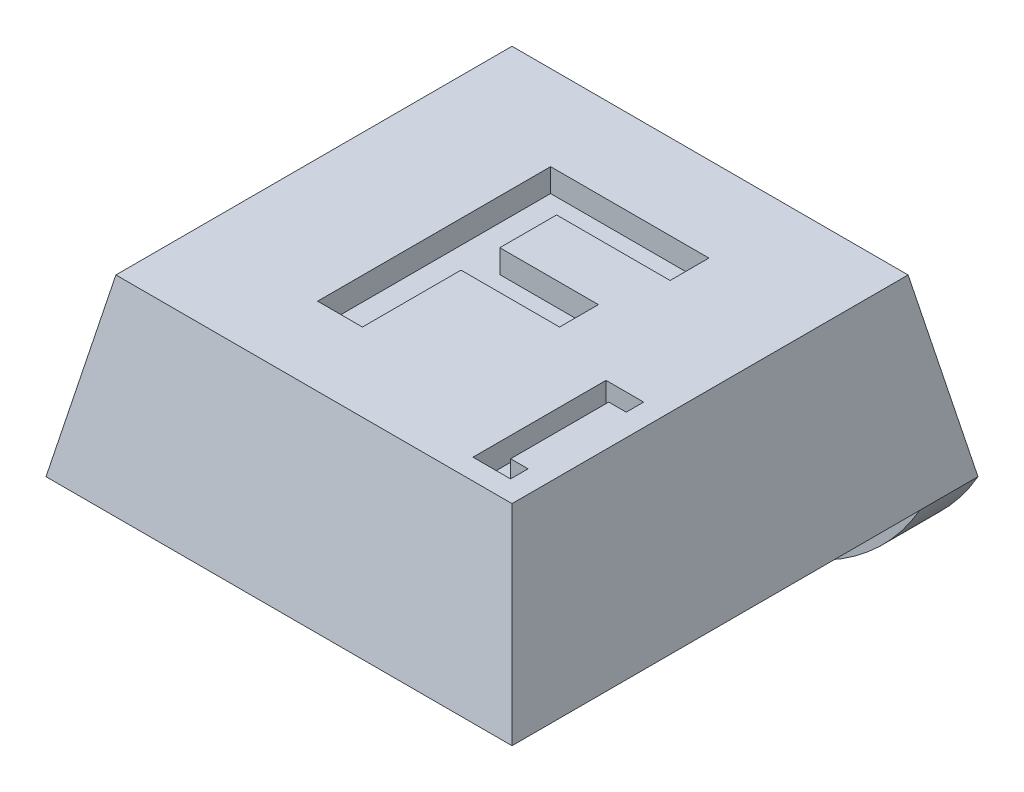
ISO-10303-21;
HEADER;
FILE_DESCRIPTION(('STEP AP214'),'2;1');
FILE_NAME('part.step','',(''),(''),'','','');
FILE_SCHEMA(('AUTOMOTIVE_DESIGN { 1 0 10303 214 1 1 1 1 }'));
ENDSEC;
DATA;
#1=APPLICATION_CONTEXT('core data for automotive mechanical design processes');
#2=APPLICATION_PROTOCOL_DEFINITION('international standard','automotive_design',2000,#1);
#3=PRODUCT_CONTEXT('',#1,'mechanical');
#4=PRODUCT('Part','Part','',(#3));
#5=PRODUCT_RELATED_PRODUCT_CATEGORY('part','',(#4));
#6=PRODUCT_DEFINITION_FORMATION('','',#4);
#7=PRODUCT_DEFINITION_CONTEXT('part definition',#1,'design');
#8=PRODUCT_DEFINITION('design','',#6,#7);
#9=PRODUCT_DEFINITION_SHAPE('','',#8);
#10=(LENGTH_UNIT() NAMED_UNIT(*) SI_UNIT(.MILLI.,.METRE.));
#11=(NAMED_UNIT(*) PLANE_ANGLE_UNIT() SI_UNIT($,.RADIAN.));
#12=(NAMED_UNIT(*) SI_UNIT($,.STERADIAN.) SOLID_ANGLE_UNIT());
#13=UNCERTAINTY_MEASURE_WITH_UNIT(LENGTH_MEASURE(1.E-05),#10,'distance_accuracy_value','');
#14=(GEOMETRIC_REPRESENTATION_CONTEXT(3) GLOBAL_UNCERTAINTY_ASSIGNED_CONTEXT((#13)) GLOBAL_UNIT_ASSIGNED_CONTEXT((#10,
#11,#12)) REPRESENTATION_CONTEXT('',''));
#15=CARTESIAN_POINT('',(0.,0.,0.));
#16=DIRECTION('',(0.,0.,1.));
#17=DIRECTION('',(1.,0.,0.));
#18=AXIS2_PLACEMENT_3D('',#15,#16,#17);
#19=CARTESIAN_POINT('',(0.,3.,0.));
#20=DIRECTION('',(0.,-1.,0.));
#21=DIRECTION('',(0.,0.,-1.));
#22=AXIS2_PLACEMENT_3D('',#19,#20,#21);
#23=PLANE('',#22);
#24=DIRECTION('',(-1.,0.,0.));
#25=VECTOR('',#24,1.);
#26=CARTESIAN_POINT('',(3.49080595744267,3.,-1.94116936627452));
#27=LINE('',#26,#25);
#28=CARTESIAN_POINT('',(3.49080595744267,3.,-1.94116936627452));
#29=VERTEX_POINT('',#28);
#30=CARTESIAN_POINT('',(2.7215751882119,3.,-1.94116936627452));
#31=VERTEX_POINT('',#30);
#32=EDGE_CURVE('E67',#29,#31,#27,.T.);
#33=ORIENTED_EDGE('',*,*,#32,.T.);
#34=DIRECTION('',(0.,0.,-1.));
#35=VECTOR('',#34,1.);
#36=CARTESIAN_POINT('',(2.7215751882119,3.,-1.94116936627452));
#37=LINE('',#36,#35);
#38=CARTESIAN_POINT('',(2.7215751882119,3.,-5.94116936627452));
#39=VERTEX_POINT('',#38);
#40=EDGE_CURVE('E240',#31,#39,#37,.T.);
#41=ORIENTED_EDGE('',*,*,#40,.T.);
#42=DIRECTION('',(1.,0.,0.));
#43=VECTOR('',#42,1.);
#44=CARTESIAN_POINT('',(2.7215751882119,3.,-5.94116936627452));
#45=LINE('',#44,#43);
#46=CARTESIAN_POINT('',(5.43952390616062,3.,-5.94116936627452));
#47=VERTEX_POINT('',#46);
#48=EDGE_CURVE('E282',#39,#47,#45,.T.);
#49=ORIENTED_EDGE('',*,*,#48,.T.);
#50=DIRECTION('',(0.,0.,1.));
#51=VECTOR('',#50,1.);
#52=CARTESIAN_POINT('',(5.43952390616062,3.,-5.94116936627452));
#53=LINE('',#52,#51);
#54=CARTESIAN_POINT('',(5.43952390616062,3.,-5.27450269960785));
#55=VERTEX_POINT('',#54);
#56=EDGE_CURVE('E286',#47,#55,#53,.T.);
#57=ORIENTED_EDGE('',*,*,#56,.T.);
#58=DIRECTION('',(-1.,0.,0.));
#59=VECTOR('',#58,1.);
#60=CARTESIAN_POINT('',(5.43952390616062,3.,-5.27450269960785));
#61=LINE('',#60,#59);
#62=CARTESIAN_POINT('',(3.49080595744267,3.,-5.27450269960785));
#63=VERTEX_POINT('',#62);
#64=EDGE_CURVE('E290',#55,#63,#61,.T.);
#65=ORIENTED_EDGE('',*,*,#64,.T.);
#66=DIRECTION('',(0.,0.,1.));
#67=VECTOR('',#66,1.);
#68=CARTESIAN_POINT('',(3.49080595744267,3.,-5.27450269960785));
#69=LINE('',#68,#67);
#70=CARTESIAN_POINT('',(3.49080595744267,3.,-4.30014372524888));
#71=VERTEX_POINT('',#70);
#72=EDGE_CURVE('E294',#63,#71,#69,.T.);
#73=ORIENTED_EDGE('',*,*,#72,.T.);
#74=DIRECTION('',(1.,0.,0.));
#75=VECTOR('',#74,1.);
#76=CARTESIAN_POINT('',(3.49080595744267,3.,-4.30014372524888));
#77=LINE('',#76,#75);
#78=CARTESIAN_POINT('',(5.18311364975036,3.,-4.30014372524888));
#79=VERTEX_POINT('',#78);
#80=EDGE_CURVE('E298',#71,#79,#77,.T.);
#81=ORIENTED_EDGE('',*,*,#80,.T.);
#82=DIRECTION('',(0.,0.,1.));
#83=VECTOR('',#82,1.);
#84=CARTESIAN_POINT('',(5.18311364975036,3.,-4.30014372524888));
#85=LINE('',#84,#83);
#86=CARTESIAN_POINT('',(5.18311364975036,3.,-3.63347705858221));
#87=VERTEX_POINT('',#86);
#88=EDGE_CURVE('E302',#79,#87,#85,.T.);
#89=ORIENTED_EDGE('',*,*,#88,.T.);
#90=DIRECTION('',(-1.,0.,0.));
#91=VECTOR('',#90,1.);
#92=CARTESIAN_POINT('',(5.18311364975036,3.,-3.63347705858221));
#93=LINE('',#92,#91);
#94=CARTESIAN_POINT('',(3.49080595744267,3.,-3.63347705858221));
#95=VERTEX_POINT('',#94);
#96=EDGE_CURVE('E306',#87,#95,#93,.T.);
#97=ORIENTED_EDGE('',*,*,#96,.T.);
#98=DIRECTION('',(0.,0.,1.));
#99=VECTOR('',#98,1.);
#100=CARTESIAN_POINT('',(3.49080595744267,3.,-3.63347705858221));
#101=LINE('',#100,#99);
#102=EDGE_CURVE('E251',#95,#29,#101,.T.);
#103=ORIENTED_EDGE('',*,*,#102,.T.);
#104=EDGE_LOOP('',(#33,#41,#49,#57,#65,#73,#81,#89,#97,#103));
#105=FACE_BOUND('',#104,.T.);
#106=DIRECTION('',(-1.,0.,0.));
#107=VECTOR('',#106,1.);
#108=CARTESIAN_POINT('',(11.,3.,-0.6));
#109=LINE('',#108,#107);
#110=CARTESIAN_POINT('',(7.4,3.,-0.6));
#111=VERTEX_POINT('',#110);
#112=CARTESIAN_POINT('',(0.6,3.,-0.6));
#113=VERTEX_POINT('',#112);
#114=EDGE_CURVE('E367',#111,#113,#109,.T.);
#115=ORIENTED_EDGE('',*,*,#114,.F.);
#116=DIRECTION('',(0.,0.,1.));
#117=VECTOR('',#116,1.);
#118=CARTESIAN_POINT('',(7.4,3.,-8.));
#119=LINE('',#118,#117);
#120=CARTESIAN_POINT('',(7.4,3.,-7.4));
#121=VERTEX_POINT('',#120);
#122=EDGE_CURVE('E380',#121,#111,#119,.T.);
#123=ORIENTED_EDGE('',*,*,#122,.F.);
#124=DIRECTION('',(-1.,0.,0.));
#125=VECTOR('',#124,1.);
#126=CARTESIAN_POINT('',(11.,3.,-7.4));
#127=LINE('',#126,#125);
#128=CARTESIAN_POINT('',(0.599999999999999,3.,-7.4));
#129=VERTEX_POINT('',#128);
#130=EDGE_CURVE('E363',#121,#129,#127,.T.);
#131=ORIENTED_EDGE('',*,*,#130,.T.);
#132=DIRECTION('',(0.,0.,1.));
#133=VECTOR('',#132,1.);
#134=CARTESIAN_POINT('',(0.6,3.,-8.));
#135=LINE('',#134,#133);
#136=EDGE_CURVE('E383',#129,#113,#135,.T.);
#137=ORIENTED_EDGE('',*,*,#136,.T.);
#138=EDGE_LOOP('',(#115,#123,#131,#137));
#139=FACE_BOUND('',#138,.T.);
#140=DIRECTION('',(-1.,0.,0.));
#141=VECTOR('',#140,1.);
#142=CARTESIAN_POINT('',(7.02065720821508,3.,-0.955347226257792));
#143=LINE('',#142,#141);
#144=CARTESIAN_POINT('',(7.02065720821508,3.,-0.955347226257792));
#145=VERTEX_POINT('',#144);
#146=CARTESIAN_POINT('',(6.37450336206124,3.,-0.955347226257792));
#147=VERTEX_POINT('',#146);
#148=EDGE_CURVE('E59',#145,#147,#143,.T.);
#149=ORIENTED_EDGE('',*,*,#148,.T.);
#150=DIRECTION('',(0.,0.,-1.));
#151=VECTOR('',#150,1.);
#152=CARTESIAN_POINT('',(6.37450336206124,3.,-0.955347226257792));
#153=LINE('',#152,#151);
#154=CARTESIAN_POINT('',(6.37450336206124,3.,-3.23996261087318));
#155=VERTEX_POINT('',#154);
#156=EDGE_CURVE('E234',#147,#155,#153,.T.);
#157=ORIENTED_EDGE('',*,*,#156,.T.);
#158=DIRECTION('',(1.,0.,0.));
#159=VECTOR('',#158,1.);
#160=CARTESIAN_POINT('',(6.37450336206124,3.,-3.23996261087318));
#161=LINE('',#160,#159);
#162=CARTESIAN_POINT('',(7.02065720821508,3.,-3.23996261087318));
#163=VERTEX_POINT('',#162);
#164=EDGE_CURVE('E487',#155,#163,#161,.T.);
#165=ORIENTED_EDGE('',*,*,#164,.T.);
#166=DIRECTION('',(0.,0.,1.));
#167=VECTOR('',#166,1.);
#168=CARTESIAN_POINT('',(7.02065720821508,3.,-3.23996261087318));
#169=LINE('',#168,#167);
#170=CARTESIAN_POINT('',(7.02065720821508,3.,-2.93996261087318));
#171=VERTEX_POINT('',#170);
#172=EDGE_CURVE('E495',#163,#171,#169,.T.);
#173=ORIENTED_EDGE('',*,*,#172,.T.);
#174=DIRECTION('',(-1.,0.,0.));
#175=VECTOR('',#174,1.);
#176=CARTESIAN_POINT('',(7.02065720821508,3.,-2.93996261087318));
#177=LINE('',#176,#175);
#178=CARTESIAN_POINT('',(6.72065720821508,3.,-2.93996261087318));
#179=VERTEX_POINT('',#178);
#180=EDGE_CURVE('E499',#171,#179,#177,.T.);
#181=ORIENTED_EDGE('',*,*,#180,.T.);
#182=DIRECTION('',(0.,0.,1.));
#183=VECTOR('',#182,1.);
#184=CARTESIAN_POINT('',(6.72065720821508,3.,-2.93996261087318));
#185=LINE('',#184,#183);
#186=CARTESIAN_POINT('',(6.72065720821508,3.,-1.25534722625779));
#187=VERTEX_POINT('',#186);
#188=EDGE_CURVE('E503',#179,#187,#185,.T.);
#189=ORIENTED_EDGE('',*,*,#188,.T.);
#190=DIRECTION('',(1.,0.,0.));
#191=VECTOR('',#190,1.);
#192=CARTESIAN_POINT('',(6.72065720821508,3.,-1.25534722625779));
#193=LINE('',#192,#191);
#194=CARTESIAN_POINT('',(7.02065720821508,3.,-1.25534722625779));
#195=VERTEX_POINT('',#194);
#196=EDGE_CURVE('E507',#187,#195,#193,.T.);
#197=ORIENTED_EDGE('',*,*,#196,.T.);
#198=DIRECTION('',(0.,0.,1.));
#199=VECTOR('',#198,1.);
#200=CARTESIAN_POINT('',(7.02065720821508,3.,-1.25534722625779));
#201=LINE('',#200,#199);
#202=EDGE_CURVE('E230',#195,#145,#201,.T.);
#203=ORIENTED_EDGE('',*,*,#202,.T.);
#204=EDGE_LOOP('',(#149,#157,#165,#173,#181,#189,#197,#203));
#205=FACE_BOUND('',#204,.T.);
#206=ADVANCED_FACE('F43',(#105,#139,#205),#23,.F.);
#207=CARTESIAN_POINT('',(8.,0.,-8.));
#208=DIRECTION('',(-0.98058067569092,-0.196116135138184,0.));
#209=DIRECTION('',(0.196116135138184,-0.98058067569092,0.));
#210=AXIS2_PLACEMENT_3D('',#207,#208,#209);
#211=PLANE('',#210);
#212=DIRECTION('',(-0.192450089729875,0.962250448649376,-0.192450089729875));
#213=VECTOR('',#212,1.);
#214=CARTESIAN_POINT('',(7.7037037037037,1.48148148148148,-0.296296296296296));
#215=LINE('',#214,#213);
#216=CARTESIAN_POINT('',(8.,0.,0.));
#217=VERTEX_POINT('',#216);
#218=EDGE_CURVE('E377',#217,#111,#215,.T.);
#219=ORIENTED_EDGE('',*,*,#218,.F.);
#220=DIRECTION('',(0.,0.,-1.));
#221=VECTOR('',#220,1.);
#222=CARTESIAN_POINT('',(8.,0.,0.));
#223=LINE('',#222,#221);
#224=CARTESIAN_POINT('',(8.,0.,-7.));
#225=VERTEX_POINT('',#224);
#226=EDGE_CURVE('E396',#217,#225,#223,.T.);
#227=ORIENTED_EDGE('',*,*,#226,.T.);
#228=DIRECTION('',(0.,0.,1.));
#229=VECTOR('',#228,1.);
#230=CARTESIAN_POINT('',(8.,0.,-8.));
#231=LINE('',#230,#229);
#232=CARTESIAN_POINT('',(8.,0.,-8.));
#233=VERTEX_POINT('',#232);
#234=EDGE_CURVE('E342',#233,#225,#231,.T.);
#235=ORIENTED_EDGE('',*,*,#234,.F.);
#236=DIRECTION('',(0.192450089729875,-0.962250448649376,-0.192450089729875));
#237=VECTOR('',#236,1.);
#238=CARTESIAN_POINT('',(8.,0.,-8.));
#239=LINE('',#238,#237);
#240=EDGE_CURVE('E370',#121,#233,#239,.T.);
#241=ORIENTED_EDGE('',*,*,#240,.F.);
#242=ORIENTED_EDGE('',*,*,#122,.T.);
#243=EDGE_LOOP('',(#219,#227,#235,#241,#242));
#244=FACE_BOUND('',#243,.T.);
#245=ADVANCED_FACE('F469',(#244),#211,.F.);
#246=CARTESIAN_POINT('',(0.,0.,-8.));
#247=DIRECTION('',(0.98058067569092,-0.196116135138184,0.));
#248=DIRECTION('',(0.196116135138184,0.98058067569092,0.));
#249=AXIS2_PLACEMENT_3D('',#246,#247,#248);
#250=PLANE('',#249);
#251=DIRECTION('',(-0.192450089729875,-0.962250448649376,0.192450089729875));
#252=VECTOR('',#251,1.);
#253=CARTESIAN_POINT('',(0.296296296296296,1.48148148148148,-0.296296296296296));
#254=LINE('',#253,#252);
#255=CARTESIAN_POINT('',(0.,0.,0.));
#256=VERTEX_POINT('',#255);
#257=EDGE_CURVE('E424',#113,#256,#254,.T.);
#258=ORIENTED_EDGE('',*,*,#257,.F.);
#259=ORIENTED_EDGE('',*,*,#136,.F.);
#260=DIRECTION('',(0.192450089729875,0.962250448649376,0.192450089729875));
#261=VECTOR('',#260,1.);
#262=CARTESIAN_POINT('',(0.,0.,-8.));
#263=LINE('',#262,#261);
#264=CARTESIAN_POINT('',(0.,0.,-8.));
#265=VERTEX_POINT('',#264);
#266=EDGE_CURVE('E395',#265,#129,#263,.T.);
#267=ORIENTED_EDGE('',*,*,#266,.F.);
#268=DIRECTION('',(0.,0.,1.));
#269=VECTOR('',#268,1.);
#270=CARTESIAN_POINT('',(0.,0.,0.));
#271=LINE('',#270,#269);
#272=CARTESIAN_POINT('',(0.,0.,-7.));
#273=VERTEX_POINT('',#272);
#274=EDGE_CURVE('E400',#265,#273,#271,.T.);
#275=ORIENTED_EDGE('',*,*,#274,.T.);
#276=EDGE_CURVE('E387',#273,#256,#271,.T.);
#277=ORIENTED_EDGE('',*,*,#276,.T.);
#278=EDGE_LOOP('',(#258,#259,#267,#275,#277));
#279=FACE_BOUND('',#278,.T.);
#280=ADVANCED_FACE('F449',(#279),#250,.F.);
#281=CARTESIAN_POINT('',(0.,0.,0.));
#282=DIRECTION('',(0.,-1.,0.));
#283=DIRECTION('',(0.,0.,-1.));
#284=AXIS2_PLACEMENT_3D('',#281,#282,#283);
#285=PLANE('',#284);
#286=DIRECTION('',(-1.,0.,0.));
#287=VECTOR('',#286,1.);
#288=CARTESIAN_POINT('',(0.,0.,-7.));
#289=LINE('',#288,#287);
#290=EDGE_CURVE('E348',#225,#273,#289,.T.);
#291=ORIENTED_EDGE('',*,*,#290,.F.);
#292=ORIENTED_EDGE('',*,*,#226,.F.);
#293=DIRECTION('',(1.,0.,0.));
#294=VECTOR('',#293,1.);
#295=CARTESIAN_POINT('',(0.,0.,0.));
#296=LINE('',#295,#294);
#297=EDGE_CURVE('E397',#256,#217,#296,.T.);
#298=ORIENTED_EDGE('',*,*,#297,.F.);
#299=ORIENTED_EDGE('',*,*,#276,.F.);
#300=EDGE_LOOP('',(#291,#292,#298,#299));
#301=FACE_BOUND('',#300,.T.);
#302=CARTESIAN_POINT('',(4.,0.,-3.75));
#303=DIRECTION('',(0.,-1.,0.));
#304=DIRECTION('',(0.,0.,-1.));
#305=AXIS2_PLACEMENT_3D('',#302,#303,#304);
#306=CIRCLE('',#305,1.75);
#307=CARTESIAN_POINT('',(4.,0.,-5.5));
#308=VERTEX_POINT('',#307);
#309=EDGE_CURVE('E352',#308,#308,#306,.T.);
#310=ORIENTED_EDGE('',*,*,#309,.F.);
#311=EDGE_LOOP('',(#310));
#312=FACE_BOUND('',#311,.T.);
#313=ADVANCED_FACE('F464',(#301,#312),#285,.T.);
#314=CARTESIAN_POINT('',(11.,3.,-7.4));
#315=DIRECTION('',(0.,0.196116135138184,-0.98058067569092));
#316=DIRECTION('',(0.,0.98058067569092,0.196116135138184));
#317=AXIS2_PLACEMENT_3D('',#314,#315,#316);
#318=PLANE('',#317);
#319=ORIENTED_EDGE('',*,*,#240,.T.);
#320=DIRECTION('',(-1.,0.,0.));
#321=VECTOR('',#320,1.);
#322=CARTESIAN_POINT('',(0.,0.,-8.));
#323=LINE('',#322,#321);
#324=EDGE_CURVE('E391',#233,#265,#323,.T.);
#325=ORIENTED_EDGE('',*,*,#324,.T.);
#326=ORIENTED_EDGE('',*,*,#266,.T.);
#327=ORIENTED_EDGE('',*,*,#130,.F.);
#328=EDGE_LOOP('',(#319,#325,#326,#327));
#329=FACE_BOUND('',#328,.T.);
#330=ADVANCED_FACE('F444',(#329),#318,.T.);
#331=CARTESIAN_POINT('',(11.,0.,0.));
#332=DIRECTION('',(0.,0.196116135138184,0.98058067569092));
#333=DIRECTION('',(0.,-0.98058067569092,0.196116135138184));
#334=AXIS2_PLACEMENT_3D('',#331,#332,#333);
#335=PLANE('',#334);
#336=ORIENTED_EDGE('',*,*,#218,.T.);
#337=ORIENTED_EDGE('',*,*,#114,.T.);
#338=ORIENTED_EDGE('',*,*,#257,.T.);
#339=ORIENTED_EDGE('',*,*,#297,.T.);
#340=EDGE_LOOP('',(#336,#337,#338,#339));
#341=FACE_BOUND('',#340,.T.);
#342=ADVANCED_FACE('F473',(#341),#335,.T.);
#343=CARTESIAN_POINT('',(4.,0.4,-3.75));
#344=DIRECTION('',(0.,-1.,0.));
#345=DIRECTION('',(0.,0.,-1.));
#346=AXIS2_PLACEMENT_3D('',#343,#344,#345);
#347=CYLINDRICAL_SURFACE('',#346,1.75);
#348=CARTESIAN_POINT('',(4.,0.4,-3.75));
#349=DIRECTION('',(0.,-1.,0.));
#350=DIRECTION('',(0.,0.,-1.));
#351=AXIS2_PLACEMENT_3D('',#348,#349,#350);
#352=CIRCLE('',#351,1.75);
#353=CARTESIAN_POINT('',(4.,0.4,-5.5));
#354=VERTEX_POINT('',#353);
#355=EDGE_CURVE('E359',#354,#354,#352,.T.);
#356=ORIENTED_EDGE('',*,*,#355,.F.);
#357=EDGE_LOOP('',(#356));
#358=FACE_BOUND('',#357,.T.);
#359=ORIENTED_EDGE('',*,*,#309,.T.);
#360=EDGE_LOOP('',(#359));
#361=FACE_BOUND('',#360,.T.);
#362=ADVANCED_FACE('F638',(#358,#361),#347,.F.);
#363=CARTESIAN_POINT('',(4.,0.4,-3.75));
#364=DIRECTION('',(0.,-1.,0.));
#365=DIRECTION('',(0.,0.,-1.));
#366=AXIS2_PLACEMENT_3D('',#363,#364,#365);
#367=PLANE('',#366);
#368=ORIENTED_EDGE('',*,*,#355,.T.);
#369=EDGE_LOOP('',(#368));
#370=FACE_BOUND('',#369,.T.);
#371=ADVANCED_FACE('F635',(#370),#367,.T.);
#372=CARTESIAN_POINT('',(0.,-2.,-8.));
#373=DIRECTION('',(0.,0.,1.));
#374=DIRECTION('',(1.,0.,0.));
#375=AXIS2_PLACEMENT_3D('',#372,#373,#374);
#376=PLANE('',#375);
#377=ORIENTED_EDGE('',*,*,#324,.F.);
#378=CARTESIAN_POINT('',(4.53589838486225,2.,-8.));
#379=DIRECTION('',(0.,0.,1.));
#380=DIRECTION('',(1.,0.,0.));
#381=AXIS2_PLACEMENT_3D('',#378,#379,#380);
#382=CIRCLE('',#381,4.);
#383=CARTESIAN_POINT('',(4.53589838486225,-2.,-8.));
#384=VERTEX_POINT('',#383);
#385=EDGE_CURVE('E11',#233,#384,#382,.F.);
#386=ORIENTED_EDGE('',*,*,#385,.T.);
#387=DIRECTION('',(1.,0.,0.));
#388=VECTOR('',#387,1.);
#389=CARTESIAN_POINT('',(0.,-2.,-8.));
#390=LINE('',#389,#388);
#391=CARTESIAN_POINT('',(3.46410161513775,-2.,-8.));
#392=VERTEX_POINT('',#391);
#393=EDGE_CURVE('E343',#392,#384,#390,.T.);
#394=ORIENTED_EDGE('',*,*,#393,.F.);
#395=CARTESIAN_POINT('',(3.46410161513775,2.,-8.));
#396=DIRECTION('',(0.,0.,1.));
#397=DIRECTION('',(1.,0.,0.));
#398=AXIS2_PLACEMENT_3D('',#395,#396,#397);
#399=CIRCLE('',#398,4.);
#400=EDGE_CURVE('E52',#392,#265,#399,.F.);
#401=ORIENTED_EDGE('',*,*,#400,.T.);
#402=EDGE_LOOP('',(#377,#386,#394,#401));
#403=FACE_BOUND('',#402,.T.);
#404=ADVANCED_FACE('F437',(#403),#376,.F.);
#405=CARTESIAN_POINT('',(0.,-2.,-7.));
#406=DIRECTION('',(0.,0.,-1.));
#407=DIRECTION('',(-1.,0.,0.));
#408=AXIS2_PLACEMENT_3D('',#405,#406,#407);
#409=PLANE('',#408);
#410=DIRECTION('',(-1.,0.,0.));
#411=VECTOR('',#410,1.);
#412=CARTESIAN_POINT('',(0.,-2.,-7.));
#413=LINE('',#412,#411);
#414=CARTESIAN_POINT('',(4.53589838486225,-2.,-7.));
#415=VERTEX_POINT('',#414);
#416=CARTESIAN_POINT('',(3.46410161513775,-2.,-7.));
#417=VERTEX_POINT('',#416);
#418=EDGE_CURVE('E347',#415,#417,#413,.T.);
#419=ORIENTED_EDGE('',*,*,#418,.F.);
#420=CARTESIAN_POINT('',(4.53589838486225,2.,-7.));
#421=DIRECTION('',(0.,0.,-1.));
#422=DIRECTION('',(-1.,0.,0.));
#423=AXIS2_PLACEMENT_3D('',#420,#421,#422);
#424=CIRCLE('',#423,4.);
#425=EDGE_CURVE('E431',#415,#225,#424,.F.);
#426=ORIENTED_EDGE('',*,*,#425,.T.);
#427=ORIENTED_EDGE('',*,*,#290,.T.);
#428=CARTESIAN_POINT('',(3.46410161513775,2.,-7.));
#429=DIRECTION('',(0.,0.,-1.));
#430=DIRECTION('',(-1.,0.,0.));
#431=AXIS2_PLACEMENT_3D('',#428,#429,#430);
#432=CIRCLE('',#431,4.);
#433=EDGE_CURVE('E428',#273,#417,#432,.F.);
#434=ORIENTED_EDGE('',*,*,#433,.T.);
#435=EDGE_LOOP('',(#419,#426,#427,#434));
#436=FACE_BOUND('',#435,.T.);
#437=ADVANCED_FACE('F455',(#436),#409,.F.);
#438=CARTESIAN_POINT('',(0.,-2.,0.));
#439=DIRECTION('',(0.,1.,0.));
#440=DIRECTION('',(0.,0.,1.));
#441=AXIS2_PLACEMENT_3D('',#438,#439,#440);
#442=PLANE('',#441);
#443=ORIENTED_EDGE('',*,*,#393,.T.);
#444=DIRECTION('',(0.,0.,1.));
#445=VECTOR('',#444,1.);
#446=CARTESIAN_POINT('',(4.53589838486225,-2.,0.));
#447=LINE('',#446,#445);
#448=EDGE_CURVE('E423',#384,#415,#447,.T.);
#449=ORIENTED_EDGE('',*,*,#448,.T.);
#450=ORIENTED_EDGE('',*,*,#418,.T.);
#451=DIRECTION('',(0.,0.,-1.));
#452=VECTOR('',#451,1.);
#453=CARTESIAN_POINT('',(3.46410161513775,-2.,0.));
#454=LINE('',#453,#452);
#455=EDGE_CURVE('E419',#417,#392,#454,.T.);
#456=ORIENTED_EDGE('',*,*,#455,.T.);
#457=EDGE_LOOP('',(#443,#449,#450,#456));
#458=FACE_BOUND('',#457,.T.);
#459=ADVANCED_FACE('F458',(#458),#442,.F.);
#460=CARTESIAN_POINT('',(4.53589838486225,2.,-8.));
#461=DIRECTION('',(0.,0.,1.));
#462=DIRECTION('',(1.,0.,0.));
#463=AXIS2_PLACEMENT_3D('',#460,#461,#462);
#464=CYLINDRICAL_SURFACE('',#463,4.);
#465=ORIENTED_EDGE('',*,*,#385,.F.);
#466=ORIENTED_EDGE('',*,*,#234,.T.);
#467=ORIENTED_EDGE('',*,*,#425,.F.);
#468=ORIENTED_EDGE('',*,*,#448,.F.);
#469=EDGE_LOOP('',(#465,#466,#467,#468));
#470=FACE_BOUND('',#469,.T.);
#471=ADVANCED_FACE('F461',(#470),#464,.T.);
#472=CARTESIAN_POINT('',(3.46410161513775,2.,-8.));
#473=DIRECTION('',(0.,0.,-1.));
#474=DIRECTION('',(-1.,0.,0.));
#475=AXIS2_PLACEMENT_3D('',#472,#473,#474);
#476=CYLINDRICAL_SURFACE('',#475,4.);
#477=ORIENTED_EDGE('',*,*,#433,.F.);
#478=ORIENTED_EDGE('',*,*,#274,.F.);
#479=ORIENTED_EDGE('',*,*,#400,.F.);
#480=ORIENTED_EDGE('',*,*,#455,.F.);
#481=EDGE_LOOP('',(#477,#478,#479,#480));
#482=FACE_BOUND('',#481,.T.);
#483=ADVANCED_FACE('F45',(#482),#476,.T.);
#484=CARTESIAN_POINT('',(3.49080595744267,2.6,-1.94116936627452));
#485=DIRECTION('',(0.,0.,-1.));
#486=DIRECTION('',(-1.,0.,0.));
#487=AXIS2_PLACEMENT_3D('',#484,#485,#486);
#488=PLANE('',#487);
#489=ORIENTED_EDGE('',*,*,#32,.F.);
#490=DIRECTION('',(0.,1.,0.));
#491=VECTOR('',#490,1.);
#492=CARTESIAN_POINT('',(3.49080595744267,2.6,-1.94116936627452));
#493=LINE('',#492,#491);
#494=CARTESIAN_POINT('',(3.49080595744267,2.6,-1.94116936627452));
#495=VERTEX_POINT('',#494);
#496=EDGE_CURVE('E277',#495,#29,#493,.T.);
#497=ORIENTED_EDGE('',*,*,#496,.F.);
#498=DIRECTION('',(-1.,0.,0.));
#499=VECTOR('',#498,1.);
#500=CARTESIAN_POINT('',(3.49080595744267,2.6,-1.94116936627452));
#501=LINE('',#500,#499);
#502=CARTESIAN_POINT('',(2.7215751882119,2.6,-1.94116936627452));
#503=VERTEX_POINT('',#502);
#504=EDGE_CURVE('E246',#495,#503,#501,.T.);
#505=ORIENTED_EDGE('',*,*,#504,.T.);
#506=DIRECTION('',(0.,1.,0.));
#507=VECTOR('',#506,1.);
#508=CARTESIAN_POINT('',(2.7215751882119,2.6,-1.94116936627452));
#509=LINE('',#508,#507);
#510=EDGE_CURVE('E339',#503,#31,#509,.T.);
#511=ORIENTED_EDGE('',*,*,#510,.T.);
#512=EDGE_LOOP('',(#489,#497,#505,#511));
#513=FACE_BOUND('',#512,.T.);
#514=ADVANCED_FACE('F625',(#513),#488,.T.);
#515=CARTESIAN_POINT('',(2.7215751882119,2.6,-1.94116936627452));
#516=DIRECTION('',(1.,0.,0.));
#517=DIRECTION('',(0.,0.,-1.));
#518=AXIS2_PLACEMENT_3D('',#515,#516,#517);
#519=PLANE('',#518);
#520=ORIENTED_EDGE('',*,*,#40,.F.);
#521=ORIENTED_EDGE('',*,*,#510,.F.);
#522=DIRECTION('',(0.,0.,-1.));
#523=VECTOR('',#522,1.);
#524=CARTESIAN_POINT('',(2.7215751882119,2.6,-1.94116936627452));
#525=LINE('',#524,#523);
#526=CARTESIAN_POINT('',(2.7215751882119,2.6,-5.94116936627452));
#527=VERTEX_POINT('',#526);
#528=EDGE_CURVE('E250',#503,#527,#525,.T.);
#529=ORIENTED_EDGE('',*,*,#528,.T.);
#530=DIRECTION('',(0.,1.,0.));
#531=VECTOR('',#530,1.);
#532=CARTESIAN_POINT('',(2.7215751882119,2.6,-5.94116936627452));
#533=LINE('',#532,#531);
#534=EDGE_CURVE('E336',#527,#39,#533,.T.);
#535=ORIENTED_EDGE('',*,*,#534,.T.);
#536=EDGE_LOOP('',(#520,#521,#529,#535));
#537=FACE_BOUND('',#536,.T.);
#538=ADVANCED_FACE('F621',(#537),#519,.T.);
#539=CARTESIAN_POINT('',(2.7215751882119,2.6,-5.94116936627452));
#540=DIRECTION('',(0.,0.,1.));
#541=DIRECTION('',(1.,0.,0.));
#542=AXIS2_PLACEMENT_3D('',#539,#540,#541);
#543=PLANE('',#542);
#544=ORIENTED_EDGE('',*,*,#48,.F.);
#545=ORIENTED_EDGE('',*,*,#534,.F.);
#546=DIRECTION('',(1.,0.,0.));
#547=VECTOR('',#546,1.);
#548=CARTESIAN_POINT('',(2.7215751882119,2.6,-5.94116936627452));
#549=LINE('',#548,#547);
#550=CARTESIAN_POINT('',(5.43952390616062,2.6,-5.94116936627452));
#551=VERTEX_POINT('',#550);
#552=EDGE_CURVE('E254',#527,#551,#549,.T.);
#553=ORIENTED_EDGE('',*,*,#552,.T.);
#554=DIRECTION('',(0.,1.,0.));
#555=VECTOR('',#554,1.);
#556=CARTESIAN_POINT('',(5.43952390616062,2.6,-5.94116936627452));
#557=LINE('',#556,#555);
#558=EDGE_CURVE('E333',#551,#47,#557,.T.);
#559=ORIENTED_EDGE('',*,*,#558,.T.);
#560=EDGE_LOOP('',(#544,#545,#553,#559));
#561=FACE_BOUND('',#560,.T.);
#562=ADVANCED_FACE('F617',(#561),#543,.T.);
#563=CARTESIAN_POINT('',(5.43952390616062,2.6,-5.94116936627452));
#564=DIRECTION('',(-1.,0.,0.));
#565=DIRECTION('',(0.,0.,1.));
#566=AXIS2_PLACEMENT_3D('',#563,#564,#565);
#567=PLANE('',#566);
#568=ORIENTED_EDGE('',*,*,#56,.F.);
#569=ORIENTED_EDGE('',*,*,#558,.F.);
#570=DIRECTION('',(0.,0.,1.));
#571=VECTOR('',#570,1.);
#572=CARTESIAN_POINT('',(5.43952390616062,2.6,-5.94116936627452));
#573=LINE('',#572,#571);
#574=CARTESIAN_POINT('',(5.43952390616062,2.6,-5.27450269960785));
#575=VERTEX_POINT('',#574);
#576=EDGE_CURVE('E257',#551,#575,#573,.T.);
#577=ORIENTED_EDGE('',*,*,#576,.T.);
#578=DIRECTION('',(0.,1.,0.));
#579=VECTOR('',#578,1.);
#580=CARTESIAN_POINT('',(5.43952390616062,2.6,-5.27450269960785));
#581=LINE('',#580,#579);
#582=EDGE_CURVE('E330',#575,#55,#581,.T.);
#583=ORIENTED_EDGE('',*,*,#582,.T.);
#584=EDGE_LOOP('',(#568,#569,#577,#583));
#585=FACE_BOUND('',#584,.T.);
#586=ADVANCED_FACE('F613',(#585),#567,.T.);
#587=CARTESIAN_POINT('',(5.43952390616062,2.6,-5.27450269960785));
#588=DIRECTION('',(0.,0.,-1.));
#589=DIRECTION('',(-1.,0.,0.));
#590=AXIS2_PLACEMENT_3D('',#587,#588,#589);
#591=PLANE('',#590);
#592=ORIENTED_EDGE('',*,*,#64,.F.);
#593=ORIENTED_EDGE('',*,*,#582,.F.);
#594=DIRECTION('',(-1.,0.,0.));
#595=VECTOR('',#594,1.);
#596=CARTESIAN_POINT('',(5.43952390616062,2.6,-5.27450269960785));
#597=LINE('',#596,#595);
#598=CARTESIAN_POINT('',(3.49080595744267,2.6,-5.27450269960785));
#599=VERTEX_POINT('',#598);
#600=EDGE_CURVE('E260',#575,#599,#597,.T.);
#601=ORIENTED_EDGE('',*,*,#600,.T.);
#602=DIRECTION('',(0.,1.,0.));
#603=VECTOR('',#602,1.);
#604=CARTESIAN_POINT('',(3.49080595744267,2.6,-5.27450269960785));
#605=LINE('',#604,#603);
#606=EDGE_CURVE('E327',#599,#63,#605,.T.);
#607=ORIENTED_EDGE('',*,*,#606,.T.);
#608=EDGE_LOOP('',(#592,#593,#601,#607));
#609=FACE_BOUND('',#608,.T.);
#610=ADVANCED_FACE('F609',(#609),#591,.T.);
#611=CARTESIAN_POINT('',(3.49080595744267,2.6,-5.27450269960785));
#612=DIRECTION('',(-1.,0.,0.));
#613=DIRECTION('',(0.,0.,1.));
#614=AXIS2_PLACEMENT_3D('',#611,#612,#613);
#615=PLANE('',#614);
#616=ORIENTED_EDGE('',*,*,#72,.F.);
#617=ORIENTED_EDGE('',*,*,#606,.F.);
#618=DIRECTION('',(0.,0.,1.));
#619=VECTOR('',#618,1.);
#620=CARTESIAN_POINT('',(3.49080595744267,2.6,-5.27450269960785));
#621=LINE('',#620,#619);
#622=CARTESIAN_POINT('',(3.49080595744267,2.6,-4.30014372524888));
#623=VERTEX_POINT('',#622);
#624=EDGE_CURVE('E263',#599,#623,#621,.T.);
#625=ORIENTED_EDGE('',*,*,#624,.T.);
#626=DIRECTION('',(0.,1.,0.));
#627=VECTOR('',#626,1.);
#628=CARTESIAN_POINT('',(3.49080595744267,2.6,-4.30014372524888));
#629=LINE('',#628,#627);
#630=EDGE_CURVE('E324',#623,#71,#629,.T.);
#631=ORIENTED_EDGE('',*,*,#630,.T.);
#632=EDGE_LOOP('',(#616,#617,#625,#631));
#633=FACE_BOUND('',#632,.T.);
#634=ADVANCED_FACE('F605',(#633),#615,.T.);
#635=CARTESIAN_POINT('',(3.49080595744267,2.6,-4.30014372524888));
#636=DIRECTION('',(0.,0.,1.));
#637=DIRECTION('',(1.,0.,0.));
#638=AXIS2_PLACEMENT_3D('',#635,#636,#637);
#639=PLANE('',#638);
#640=ORIENTED_EDGE('',*,*,#80,.F.);
#641=ORIENTED_EDGE('',*,*,#630,.F.);
#642=DIRECTION('',(1.,0.,0.));
#643=VECTOR('',#642,1.);
#644=CARTESIAN_POINT('',(3.49080595744267,2.6,-4.30014372524888));
#645=LINE('',#644,#643);
#646=CARTESIAN_POINT('',(5.18311364975036,2.6,-4.30014372524888));
#647=VERTEX_POINT('',#646);
#648=EDGE_CURVE('E266',#623,#647,#645,.T.);
#649=ORIENTED_EDGE('',*,*,#648,.T.);
#650=DIRECTION('',(0.,1.,0.));
#651=VECTOR('',#650,1.);
#652=CARTESIAN_POINT('',(5.18311364975036,2.6,-4.30014372524888));
#653=LINE('',#652,#651);
#654=EDGE_CURVE('E321',#647,#79,#653,.T.);
#655=ORIENTED_EDGE('',*,*,#654,.T.);
#656=EDGE_LOOP('',(#640,#641,#649,#655));
#657=FACE_BOUND('',#656,.T.);
#658=ADVANCED_FACE('F601',(#657),#639,.T.);
#659=CARTESIAN_POINT('',(5.18311364975036,2.6,-4.30014372524888));
#660=DIRECTION('',(-1.,0.,0.));
#661=DIRECTION('',(0.,0.,1.));
#662=AXIS2_PLACEMENT_3D('',#659,#660,#661);
#663=PLANE('',#662);
#664=ORIENTED_EDGE('',*,*,#88,.F.);
#665=ORIENTED_EDGE('',*,*,#654,.F.);
#666=DIRECTION('',(0.,0.,1.));
#667=VECTOR('',#666,1.);
#668=CARTESIAN_POINT('',(5.18311364975036,2.6,-4.30014372524888));
#669=LINE('',#668,#667);
#670=CARTESIAN_POINT('',(5.18311364975036,2.6,-3.63347705858221));
#671=VERTEX_POINT('',#670);
#672=EDGE_CURVE('E269',#647,#671,#669,.T.);
#673=ORIENTED_EDGE('',*,*,#672,.T.);
#674=DIRECTION('',(0.,1.,0.));
#675=VECTOR('',#674,1.);
#676=CARTESIAN_POINT('',(5.18311364975036,2.6,-3.63347705858221));
#677=LINE('',#676,#675);
#678=EDGE_CURVE('E318',#671,#87,#677,.T.);
#679=ORIENTED_EDGE('',*,*,#678,.T.);
#680=EDGE_LOOP('',(#664,#665,#673,#679));
#681=FACE_BOUND('',#680,.T.);
#682=ADVANCED_FACE('F597',(#681),#663,.T.);
#683=CARTESIAN_POINT('',(5.18311364975036,2.6,-3.63347705858221));
#684=DIRECTION('',(0.,0.,-1.));
#685=DIRECTION('',(-1.,0.,0.));
#686=AXIS2_PLACEMENT_3D('',#683,#684,#685);
#687=PLANE('',#686);
#688=ORIENTED_EDGE('',*,*,#96,.F.);
#689=ORIENTED_EDGE('',*,*,#678,.F.);
#690=DIRECTION('',(-1.,0.,0.));
#691=VECTOR('',#690,1.);
#692=CARTESIAN_POINT('',(5.18311364975036,2.6,-3.63347705858221));
#693=LINE('',#692,#691);
#694=CARTESIAN_POINT('',(3.49080595744267,2.6,-3.63347705858221));
#695=VERTEX_POINT('',#694);
#696=EDGE_CURVE('E272',#671,#695,#693,.T.);
#697=ORIENTED_EDGE('',*,*,#696,.T.);
#698=DIRECTION('',(0.,1.,0.));
#699=VECTOR('',#698,1.);
#700=CARTESIAN_POINT('',(3.49080595744267,2.6,-3.63347705858221));
#701=LINE('',#700,#699);
#702=EDGE_CURVE('E315',#695,#95,#701,.T.);
#703=ORIENTED_EDGE('',*,*,#702,.T.);
#704=EDGE_LOOP('',(#688,#689,#697,#703));
#705=FACE_BOUND('',#704,.T.);
#706=ADVANCED_FACE('F593',(#705),#687,.T.);
#707=CARTESIAN_POINT('',(3.49080595744267,2.6,-3.63347705858221));
#708=DIRECTION('',(-1.,0.,0.));
#709=DIRECTION('',(0.,0.,1.));
#710=AXIS2_PLACEMENT_3D('',#707,#708,#709);
#711=PLANE('',#710);
#712=ORIENTED_EDGE('',*,*,#102,.F.);
#713=ORIENTED_EDGE('',*,*,#702,.F.);
#714=DIRECTION('',(0.,0.,1.));
#715=VECTOR('',#714,1.);
#716=CARTESIAN_POINT('',(3.49080595744267,2.6,-3.63347705858221));
#717=LINE('',#716,#715);
#718=EDGE_CURVE('E275',#695,#495,#717,.T.);
#719=ORIENTED_EDGE('',*,*,#718,.T.);
#720=ORIENTED_EDGE('',*,*,#496,.T.);
#721=EDGE_LOOP('',(#712,#713,#719,#720));
#722=FACE_BOUND('',#721,.T.);
#723=ADVANCED_FACE('F589',(#722),#711,.T.);
#724=CARTESIAN_POINT('',(0.,2.6,0.));
#725=DIRECTION('',(0.,-1.,0.));
#726=DIRECTION('',(0.,0.,-1.));
#727=AXIS2_PLACEMENT_3D('',#724,#725,#726);
#728=PLANE('',#727);
#729=ORIENTED_EDGE('',*,*,#504,.F.);
#730=ORIENTED_EDGE('',*,*,#718,.F.);
#731=ORIENTED_EDGE('',*,*,#696,.F.);
#732=ORIENTED_EDGE('',*,*,#672,.F.);
#733=ORIENTED_EDGE('',*,*,#648,.F.);
#734=ORIENTED_EDGE('',*,*,#624,.F.);
#735=ORIENTED_EDGE('',*,*,#600,.F.);
#736=ORIENTED_EDGE('',*,*,#576,.F.);
#737=ORIENTED_EDGE('',*,*,#552,.F.);
#738=ORIENTED_EDGE('',*,*,#528,.F.);
#739=EDGE_LOOP('',(#729,#730,#731,#732,#733,#734,#735,#736,#737,#738));
#740=FACE_BOUND('',#739,.T.);
#741=ADVANCED_FACE('F586',(#740),#728,.F.);
#742=CARTESIAN_POINT('',(7.02065720821508,2.6,-0.955347226257792));
#743=DIRECTION('',(0.,0.,-1.));
#744=DIRECTION('',(-1.,0.,0.));
#745=AXIS2_PLACEMENT_3D('',#742,#743,#744);
#746=PLANE('',#745);
#747=ORIENTED_EDGE('',*,*,#148,.F.);
#748=DIRECTION('',(0.,1.,0.));
#749=VECTOR('',#748,1.);
#750=CARTESIAN_POINT('',(7.02065720821508,2.6,-0.955347226257792));
#751=LINE('',#750,#749);
#752=CARTESIAN_POINT('',(7.02065720821508,2.6,-0.955347226257792));
#753=VERTEX_POINT('',#752);
#754=EDGE_CURVE('E228',#753,#145,#751,.T.);
#755=ORIENTED_EDGE('',*,*,#754,.F.);
#756=DIRECTION('',(-1.,0.,0.));
#757=VECTOR('',#756,1.);
#758=CARTESIAN_POINT('',(7.02065720821508,2.6,-0.955347226257792));
#759=LINE('',#758,#757);
#760=CARTESIAN_POINT('',(6.37450336206124,2.6,-0.955347226257792));
#761=VERTEX_POINT('',#760);
#762=EDGE_CURVE('E218',#753,#761,#759,.T.);
#763=ORIENTED_EDGE('',*,*,#762,.T.);
#764=DIRECTION('',(0.,1.,0.));
#765=VECTOR('',#764,1.);
#766=CARTESIAN_POINT('',(6.37450336206124,2.6,-0.955347226257792));
#767=LINE('',#766,#765);
#768=EDGE_CURVE('E227',#761,#147,#767,.T.);
#769=ORIENTED_EDGE('',*,*,#768,.T.);
#770=EDGE_LOOP('',(#747,#755,#763,#769));
#771=FACE_BOUND('',#770,.T.);
#772=ADVANCED_FACE('F226',(#771),#746,.T.);
#773=CARTESIAN_POINT('',(6.37450336206124,2.6,-0.955347226257792));
#774=DIRECTION('',(1.,0.,0.));
#775=DIRECTION('',(0.,0.,-1.));
#776=AXIS2_PLACEMENT_3D('',#773,#774,#775);
#777=PLANE('',#776);
#778=ORIENTED_EDGE('',*,*,#156,.F.);
#779=ORIENTED_EDGE('',*,*,#768,.F.);
#780=DIRECTION('',(0.,0.,-1.));
#781=VECTOR('',#780,1.);
#782=CARTESIAN_POINT('',(6.37450336206124,2.6,-0.955347226257792));
#783=LINE('',#782,#781);
#784=CARTESIAN_POINT('',(6.37450336206124,2.6,-3.23996261087318));
#785=VERTEX_POINT('',#784);
#786=EDGE_CURVE('E214',#761,#785,#783,.T.);
#787=ORIENTED_EDGE('',*,*,#786,.T.);
#788=DIRECTION('',(0.,1.,0.));
#789=VECTOR('',#788,1.);
#790=CARTESIAN_POINT('',(6.37450336206124,2.6,-3.23996261087318));
#791=LINE('',#790,#789);
#792=EDGE_CURVE('E236',#785,#155,#791,.T.);
#793=ORIENTED_EDGE('',*,*,#792,.T.);
#794=EDGE_LOOP('',(#778,#779,#787,#793));
#795=FACE_BOUND('',#794,.T.);
#796=ADVANCED_FACE('F232',(#795),#777,.T.);
#797=CARTESIAN_POINT('',(6.37450336206124,2.6,-3.23996261087318));
#798=DIRECTION('',(0.,0.,1.));
#799=DIRECTION('',(1.,0.,0.));
#800=AXIS2_PLACEMENT_3D('',#797,#798,#799);
#801=PLANE('',#800);
#802=ORIENTED_EDGE('',*,*,#164,.F.);
#803=ORIENTED_EDGE('',*,*,#792,.F.);
#804=DIRECTION('',(1.,0.,0.));
#805=VECTOR('',#804,1.);
#806=CARTESIAN_POINT('',(6.37450336206124,2.6,-3.23996261087318));
#807=LINE('',#806,#805);
#808=CARTESIAN_POINT('',(7.02065720821508,2.6,-3.23996261087318));
#809=VERTEX_POINT('',#808);
#810=EDGE_CURVE('E220',#785,#809,#807,.T.);
#811=ORIENTED_EDGE('',*,*,#810,.T.);
#812=DIRECTION('',(0.,1.,0.));
#813=VECTOR('',#812,1.);
#814=CARTESIAN_POINT('',(7.02065720821508,2.6,-3.23996261087318));
#815=LINE('',#814,#813);
#816=EDGE_CURVE('E242',#809,#163,#815,.T.);
#817=ORIENTED_EDGE('',*,*,#816,.T.);
#818=EDGE_LOOP('',(#802,#803,#811,#817));
#819=FACE_BOUND('',#818,.T.);
#820=ADVANCED_FACE('F530',(#819),#801,.T.);
#821=CARTESIAN_POINT('',(7.02065720821508,2.6,-3.23996261087318));
#822=DIRECTION('',(-1.,0.,0.));
#823=DIRECTION('',(0.,0.,1.));
#824=AXIS2_PLACEMENT_3D('',#821,#822,#823);
#825=PLANE('',#824);
#826=ORIENTED_EDGE('',*,*,#172,.F.);
#827=ORIENTED_EDGE('',*,*,#816,.F.);
#828=DIRECTION('',(0.,0.,1.));
#829=VECTOR('',#828,1.);
#830=CARTESIAN_POINT('',(7.02065720821508,2.6,-3.23996261087318));
#831=LINE('',#830,#829);
#832=CARTESIAN_POINT('',(7.02065720821508,2.6,-2.93996261087318));
#833=VERTEX_POINT('',#832);
#834=EDGE_CURVE('E561',#809,#833,#831,.T.);
#835=ORIENTED_EDGE('',*,*,#834,.T.);
#836=DIRECTION('',(0.,1.,0.));
#837=VECTOR('',#836,1.);
#838=CARTESIAN_POINT('',(7.02065720821508,2.6,-2.93996261087318));
#839=LINE('',#838,#837);
#840=EDGE_CURVE('E523',#833,#171,#839,.T.);
#841=ORIENTED_EDGE('',*,*,#840,.T.);
#842=EDGE_LOOP('',(#826,#827,#835,#841));
#843=FACE_BOUND('',#842,.T.);
#844=ADVANCED_FACE('F532',(#843),#825,.T.);
#845=CARTESIAN_POINT('',(7.02065720821508,2.6,-2.93996261087318));
#846=DIRECTION('',(0.,0.,-1.));
#847=DIRECTION('',(-1.,0.,0.));
#848=AXIS2_PLACEMENT_3D('',#845,#846,#847);
#849=PLANE('',#848);
#850=ORIENTED_EDGE('',*,*,#180,.F.);
#851=ORIENTED_EDGE('',*,*,#840,.F.);
#852=DIRECTION('',(-1.,0.,0.));
#853=VECTOR('',#852,1.);
#854=CARTESIAN_POINT('',(7.02065720821508,2.6,-2.93996261087318));
#855=LINE('',#854,#853);
#856=CARTESIAN_POINT('',(6.72065720821508,2.6,-2.93996261087318));
#857=VERTEX_POINT('',#856);
#858=EDGE_CURVE('E540',#833,#857,#855,.T.);
#859=ORIENTED_EDGE('',*,*,#858,.T.);
#860=DIRECTION('',(0.,1.,0.));
#861=VECTOR('',#860,1.);
#862=CARTESIAN_POINT('',(6.72065720821508,2.6,-2.93996261087318));
#863=LINE('',#862,#861);
#864=EDGE_CURVE('E520',#857,#179,#863,.T.);
#865=ORIENTED_EDGE('',*,*,#864,.T.);
#866=EDGE_LOOP('',(#850,#851,#859,#865));
#867=FACE_BOUND('',#866,.T.);
#868=ADVANCED_FACE('F537',(#867),#849,.T.);
#869=CARTESIAN_POINT('',(6.72065720821508,2.6,-2.93996261087318));
#870=DIRECTION('',(-1.,0.,0.));
#871=DIRECTION('',(0.,0.,1.));
#872=AXIS2_PLACEMENT_3D('',#869,#870,#871);
#873=PLANE('',#872);
#874=ORIENTED_EDGE('',*,*,#188,.F.);
#875=ORIENTED_EDGE('',*,*,#864,.F.);
#876=DIRECTION('',(0.,0.,1.));
#877=VECTOR('',#876,1.);
#878=CARTESIAN_POINT('',(6.72065720821508,2.6,-2.93996261087318));
#879=LINE('',#878,#877);
#880=CARTESIAN_POINT('',(6.72065720821508,2.6,-1.25534722625779));
#881=VERTEX_POINT('',#880);
#882=EDGE_CURVE('E546',#857,#881,#879,.T.);
#883=ORIENTED_EDGE('',*,*,#882,.T.);
#884=DIRECTION('',(0.,1.,0.));
#885=VECTOR('',#884,1.);
#886=CARTESIAN_POINT('',(6.72065720821508,2.6,-1.25534722625779));
#887=LINE('',#886,#885);
#888=EDGE_CURVE('E517',#881,#187,#887,.T.);
#889=ORIENTED_EDGE('',*,*,#888,.T.);
#890=EDGE_LOOP('',(#874,#875,#883,#889));
#891=FACE_BOUND('',#890,.T.);
#892=ADVANCED_FACE('F543',(#891),#873,.T.);
#893=CARTESIAN_POINT('',(6.72065720821508,2.6,-1.25534722625779));
#894=DIRECTION('',(0.,0.,1.));
#895=DIRECTION('',(1.,0.,0.));
#896=AXIS2_PLACEMENT_3D('',#893,#894,#895);
#897=PLANE('',#896);
#898=ORIENTED_EDGE('',*,*,#196,.F.);
#899=ORIENTED_EDGE('',*,*,#888,.F.);
#900=DIRECTION('',(1.,0.,0.));
#901=VECTOR('',#900,1.);
#902=CARTESIAN_POINT('',(6.72065720821508,2.6,-1.25534722625779));
#903=LINE('',#902,#901);
#904=CARTESIAN_POINT('',(7.02065720821508,2.6,-1.25534722625779));
#905=VERTEX_POINT('',#904);
#906=EDGE_CURVE('E551',#881,#905,#903,.T.);
#907=ORIENTED_EDGE('',*,*,#906,.T.);
#908=DIRECTION('',(0.,1.,0.));
#909=VECTOR('',#908,1.);
#910=CARTESIAN_POINT('',(7.02065720821508,2.6,-1.25534722625779));
#911=LINE('',#910,#909);
#912=EDGE_CURVE('E514',#905,#195,#911,.T.);
#913=ORIENTED_EDGE('',*,*,#912,.T.);
#914=EDGE_LOOP('',(#898,#899,#907,#913));
#915=FACE_BOUND('',#914,.T.);
#916=ADVANCED_FACE('F549',(#915),#897,.T.);
#917=CARTESIAN_POINT('',(7.02065720821508,2.6,-1.25534722625779));
#918=DIRECTION('',(-1.,0.,0.));
#919=DIRECTION('',(0.,0.,1.));
#920=AXIS2_PLACEMENT_3D('',#917,#918,#919);
#921=PLANE('',#920);
#922=ORIENTED_EDGE('',*,*,#202,.F.);
#923=ORIENTED_EDGE('',*,*,#912,.F.);
#924=DIRECTION('',(0.,0.,1.));
#925=VECTOR('',#924,1.);
#926=CARTESIAN_POINT('',(7.02065720821508,2.6,-1.25534722625779));
#927=LINE('',#926,#925);
#928=EDGE_CURVE('E490',#905,#753,#927,.T.);
#929=ORIENTED_EDGE('',*,*,#928,.T.);
#930=ORIENTED_EDGE('',*,*,#754,.T.);
#931=EDGE_LOOP('',(#922,#923,#929,#930));
#932=FACE_BOUND('',#931,.T.);
#933=ADVANCED_FACE('F553',(#932),#921,.T.);
#934=CARTESIAN_POINT('',(0.,2.6,0.));
#935=DIRECTION('',(0.,-1.,0.));
#936=DIRECTION('',(0.,0.,-1.));
#937=AXIS2_PLACEMENT_3D('',#934,#935,#936);
#938=PLANE('',#937);
#939=ORIENTED_EDGE('',*,*,#762,.F.);
#940=ORIENTED_EDGE('',*,*,#928,.F.);
#941=ORIENTED_EDGE('',*,*,#906,.F.);
#942=ORIENTED_EDGE('',*,*,#882,.F.);
#943=ORIENTED_EDGE('',*,*,#858,.F.);
#944=ORIENTED_EDGE('',*,*,#834,.F.);
#945=ORIENTED_EDGE('',*,*,#810,.F.);
#946=ORIENTED_EDGE('',*,*,#786,.F.);
#947=EDGE_LOOP('',(#939,#940,#941,#942,#943,#944,#945,#946));
#948=FACE_BOUND('',#947,.T.);
#949=ADVANCED_FACE('F216',(#948),#938,.F.);
#950=CLOSED_SHELL('',(#206,#245,#280,#313,#330,#342,#362,#371,#404,#437,#459,#471,#483,#514,
#538,#562,#586,#610,#634,#658,#682,#706,#723,#741,#772,#796,#820,#844,#868,#892,#916,#933,#949));
#951=MANIFOLD_SOLID_BREP('B2',#950);
#952=ADVANCED_BREP_SHAPE_REPRESENTATION('',(#18,#951),#14);
#953=SHAPE_DEFINITION_REPRESENTATION(#9,#952);
ENDSEC;
END-ISO-10303-21;
